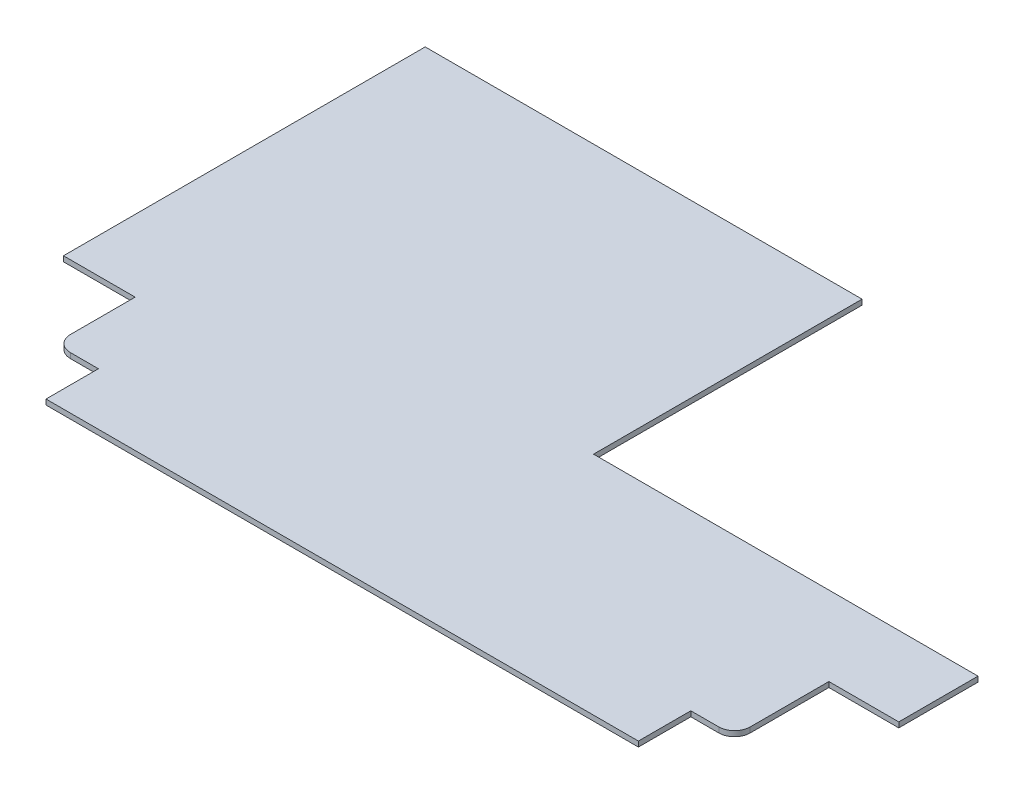
ISO-10303-21;
HEADER;
FILE_DESCRIPTION(('STEP AP214'),'2;1');
FILE_NAME('part.step','',(''),(''),'','','');
FILE_SCHEMA(('AUTOMOTIVE_DESIGN { 1 0 10303 214 1 1 1 1 }'));
ENDSEC;
DATA;
#1=APPLICATION_CONTEXT('core data for automotive mechanical design processes');
#2=APPLICATION_PROTOCOL_DEFINITION('international standard','automotive_design',2000,#1);
#3=PRODUCT_CONTEXT('',#1,'mechanical');
#4=PRODUCT('Part','Part','',(#3));
#5=PRODUCT_RELATED_PRODUCT_CATEGORY('part','',(#4));
#6=PRODUCT_DEFINITION_FORMATION('','',#4);
#7=PRODUCT_DEFINITION_CONTEXT('part definition',#1,'design');
#8=PRODUCT_DEFINITION('design','',#6,#7);
#9=PRODUCT_DEFINITION_SHAPE('','',#8);
#10=(LENGTH_UNIT() NAMED_UNIT(*) SI_UNIT(.MILLI.,.METRE.));
#11=(NAMED_UNIT(*) PLANE_ANGLE_UNIT() SI_UNIT($,.RADIAN.));
#12=(NAMED_UNIT(*) SI_UNIT($,.STERADIAN.) SOLID_ANGLE_UNIT());
#13=UNCERTAINTY_MEASURE_WITH_UNIT(LENGTH_MEASURE(1.E-05),#10,'distance_accuracy_value','');
#14=(GEOMETRIC_REPRESENTATION_CONTEXT(3) GLOBAL_UNCERTAINTY_ASSIGNED_CONTEXT((#13)) GLOBAL_UNIT_ASSIGNED_CONTEXT((#10,
#11,#12)) REPRESENTATION_CONTEXT('',''));
#15=CARTESIAN_POINT('',(0.,0.,0.));
#16=DIRECTION('',(0.,0.,1.));
#17=DIRECTION('',(1.,0.,0.));
#18=AXIS2_PLACEMENT_3D('',#15,#16,#17);
#19=CARTESIAN_POINT('',(-125.,3.,125.));
#20=DIRECTION('',(0.,0.,-1.));
#21=DIRECTION('',(-1.,0.,0.));
#22=AXIS2_PLACEMENT_3D('',#19,#20,#21);
#23=PLANE('',#22);
#24=DIRECTION('',(1.,0.,0.));
#25=VECTOR('',#24,1.);
#26=CARTESIAN_POINT('',(-125.,0.,125.));
#27=LINE('',#26,#25);
#28=CARTESIAN_POINT('',(280.,0.,125.));
#29=VERTEX_POINT('',#28);
#30=CARTESIAN_POINT('',(296.,0.,125.));
#31=VERTEX_POINT('',#30);
#32=EDGE_CURVE('E230',#29,#31,#27,.T.);
#33=ORIENTED_EDGE('',*,*,#32,.T.);
#34=DIRECTION('',(0.,1.,0.));
#35=VECTOR('',#34,1.);
#36=CARTESIAN_POINT('',(296.,0.,125.));
#37=LINE('',#36,#35);
#38=CARTESIAN_POINT('',(296.,3.,125.));
#39=VERTEX_POINT('',#38);
#40=EDGE_CURVE('E329',#31,#39,#37,.T.);
#41=ORIENTED_EDGE('',*,*,#40,.T.);
#42=DIRECTION('',(1.,0.,0.));
#43=VECTOR('',#42,1.);
#44=CARTESIAN_POINT('',(-125.,3.,125.));
#45=LINE('',#44,#43);
#46=CARTESIAN_POINT('',(280.,3.,125.));
#47=VERTEX_POINT('',#46);
#48=EDGE_CURVE('E49',#47,#39,#45,.T.);
#49=ORIENTED_EDGE('',*,*,#48,.F.);
#50=DIRECTION('',(0.,1.,0.));
#51=VECTOR('',#50,1.);
#52=CARTESIAN_POINT('',(280.,0.,125.));
#53=LINE('',#52,#51);
#54=EDGE_CURVE('E287',#29,#47,#53,.T.);
#55=ORIENTED_EDGE('',*,*,#54,.F.);
#56=EDGE_LOOP('',(#33,#41,#49,#55));
#57=FACE_BOUND('',#56,.T.);
#58=ADVANCED_FACE('F39',(#57),#23,.F.);
#59=CARTESIAN_POINT('',(-75.,0.,125.));
#60=VERTEX_POINT('',#59);
#61=CARTESIAN_POINT('',(-59.,0.,125.));
#62=VERTEX_POINT('',#61);
#63=EDGE_CURVE('E43',#60,#62,#27,.T.);
#64=ORIENTED_EDGE('',*,*,#63,.T.);
#65=DIRECTION('',(0.,1.,0.));
#66=VECTOR('',#65,1.);
#67=CARTESIAN_POINT('',(-59.,0.,125.));
#68=LINE('',#67,#66);
#69=CARTESIAN_POINT('',(-59.,3.,125.));
#70=VERTEX_POINT('',#69);
#71=EDGE_CURVE('E249',#62,#70,#68,.T.);
#72=ORIENTED_EDGE('',*,*,#71,.T.);
#73=CARTESIAN_POINT('',(-75.,3.,125.));
#74=VERTEX_POINT('',#73);
#75=EDGE_CURVE('E11',#74,#70,#45,.T.);
#76=ORIENTED_EDGE('',*,*,#75,.F.);
#77=DIRECTION('',(0.,1.,0.));
#78=VECTOR('',#77,1.);
#79=CARTESIAN_POINT('',(-75.,0.,125.));
#80=LINE('',#79,#78);
#81=EDGE_CURVE('E250',#60,#74,#80,.T.);
#82=ORIENTED_EDGE('',*,*,#81,.F.);
#83=EDGE_LOOP('',(#64,#72,#76,#82));
#84=FACE_BOUND('',#83,.T.);
#85=ADVANCED_FACE('F247',(#84),#23,.F.);
#86=CARTESIAN_POINT('',(0.,3.,0.));
#87=DIRECTION('',(0.,1.,0.));
#88=DIRECTION('',(0.,0.,1.));
#89=AXIS2_PLACEMENT_3D('',#86,#87,#88);
#90=PLANE('',#89);
#91=DIRECTION('',(0.,0.,-1.));
#92=VECTOR('',#91,1.);
#93=CARTESIAN_POINT('',(305.,3.,71.9999999999999));
#94=LINE('',#93,#92);
#95=CARTESIAN_POINT('',(305.,3.,116.));
#96=VERTEX_POINT('',#95);
#97=CARTESIAN_POINT('',(305.,3.,70.9999999999999));
#98=VERTEX_POINT('',#97);
#99=EDGE_CURVE('E334',#96,#98,#94,.T.);
#100=ORIENTED_EDGE('',*,*,#99,.T.);
#101=DIRECTION('',(-1.,0.,0.));
#102=VECTOR('',#101,1.);
#103=CARTESIAN_POINT('',(305.,3.,70.9999999999999));
#104=LINE('',#103,#102);
#105=CARTESIAN_POINT('',(345.,3.,70.9999999999999));
#106=VERTEX_POINT('',#105);
#107=EDGE_CURVE('E167',#106,#98,#104,.T.);
#108=ORIENTED_EDGE('',*,*,#107,.F.);
#109=DIRECTION('',(0.,0.,-1.));
#110=VECTOR('',#109,1.);
#111=CARTESIAN_POINT('',(345.,3.,125.));
#112=LINE('',#111,#110);
#113=CARTESIAN_POINT('',(345.,3.,25.6599999999999));
#114=VERTEX_POINT('',#113);
#115=EDGE_CURVE('E175',#106,#114,#112,.T.);
#116=ORIENTED_EDGE('',*,*,#115,.T.);
#117=DIRECTION('',(-1.,0.,0.));
#118=VECTOR('',#117,1.);
#119=CARTESIAN_POINT('',(125.,3.,25.6599999999999));
#120=LINE('',#119,#118);
#121=CARTESIAN_POINT('',(125.,3.,25.6599999999999));
#122=VERTEX_POINT('',#121);
#123=EDGE_CURVE('E184',#114,#122,#120,.T.);
#124=ORIENTED_EDGE('',*,*,#123,.T.);
#125=DIRECTION('',(0.,0.,-1.));
#126=VECTOR('',#125,1.);
#127=CARTESIAN_POINT('',(125.,3.,-125.));
#128=LINE('',#127,#126);
#129=CARTESIAN_POINT('',(125.,3.,-128.));
#130=VERTEX_POINT('',#129);
#131=EDGE_CURVE('E221',#122,#130,#128,.T.);
#132=ORIENTED_EDGE('',*,*,#131,.T.);
#133=DIRECTION('',(-1.,0.,0.));
#134=VECTOR('',#133,1.);
#135=CARTESIAN_POINT('',(-125.,3.,-128.));
#136=LINE('',#135,#134);
#137=CARTESIAN_POINT('',(-125.,3.,-128.));
#138=VERTEX_POINT('',#137);
#139=EDGE_CURVE('E202',#130,#138,#136,.T.);
#140=ORIENTED_EDGE('',*,*,#139,.T.);
#141=DIRECTION('',(0.,0.,1.));
#142=VECTOR('',#141,1.);
#143=CARTESIAN_POINT('',(-125.,3.,-125.));
#144=LINE('',#143,#142);
#145=CARTESIAN_POINT('',(-125.,3.,79.));
#146=VERTEX_POINT('',#145);
#147=EDGE_CURVE('E224',#138,#146,#144,.T.);
#148=ORIENTED_EDGE('',*,*,#147,.T.);
#149=DIRECTION('',(1.,0.,0.));
#150=VECTOR('',#149,1.);
#151=CARTESIAN_POINT('',(-125.,3.,79.));
#152=LINE('',#151,#150);
#153=CARTESIAN_POINT('',(-84.,3.,79.));
#154=VERTEX_POINT('',#153);
#155=EDGE_CURVE('E315',#146,#154,#152,.T.);
#156=ORIENTED_EDGE('',*,*,#155,.T.);
#157=DIRECTION('',(0.,0.,-1.));
#158=VECTOR('',#157,1.);
#159=CARTESIAN_POINT('',(-84.,3.,125.));
#160=LINE('',#159,#158);
#161=CARTESIAN_POINT('',(-84.,3.,116.));
#162=VERTEX_POINT('',#161);
#163=EDGE_CURVE('E62',#162,#154,#160,.T.);
#164=ORIENTED_EDGE('',*,*,#163,.F.);
#165=CARTESIAN_POINT('',(-75.,3.,116.));
#166=DIRECTION('',(0.,-1.,0.));
#167=DIRECTION('',(0.,0.,-1.));
#168=AXIS2_PLACEMENT_3D('',#165,#166,#167);
#169=CIRCLE('',#168,8.99999999999999);
#170=EDGE_CURVE('E286',#74,#162,#169,.T.);
#171=ORIENTED_EDGE('',*,*,#170,.F.);
#172=ORIENTED_EDGE('',*,*,#75,.T.);
#173=DIRECTION('',(0.,0.,1.));
#174=VECTOR('',#173,1.);
#175=CARTESIAN_POINT('',(-59.,3.,125.));
#176=LINE('',#175,#174);
#177=CARTESIAN_POINT('',(-59.,3.,155.));
#178=VERTEX_POINT('',#177);
#179=EDGE_CURVE('E277',#70,#178,#176,.T.);
#180=ORIENTED_EDGE('',*,*,#179,.T.);
#181=DIRECTION('',(1.,0.,0.));
#182=VECTOR('',#181,1.);
#183=CARTESIAN_POINT('',(-59.,3.,155.));
#184=LINE('',#183,#182);
#185=CARTESIAN_POINT('',(280.,3.,155.));
#186=VERTEX_POINT('',#185);
#187=EDGE_CURVE('E268',#178,#186,#184,.T.);
#188=ORIENTED_EDGE('',*,*,#187,.T.);
#189=DIRECTION('',(0.,0.,-1.));
#190=VECTOR('',#189,1.);
#191=CARTESIAN_POINT('',(280.,3.,125.));
#192=LINE('',#191,#190);
#193=EDGE_CURVE('E262',#186,#47,#192,.T.);
#194=ORIENTED_EDGE('',*,*,#193,.T.);
#195=ORIENTED_EDGE('',*,*,#48,.T.);
#196=CARTESIAN_POINT('',(296.,3.,116.));
#197=DIRECTION('',(0.,1.,0.));
#198=DIRECTION('',(0.,0.,-1.));
#199=AXIS2_PLACEMENT_3D('',#196,#197,#198);
#200=CIRCLE('',#199,9.00000000000001);
#201=EDGE_CURVE('E324',#39,#96,#200,.T.);
#202=ORIENTED_EDGE('',*,*,#201,.T.);
#203=EDGE_LOOP('',(#100,#108,#116,#124,#132,#140,#148,#156,#164,#171,#172,#180,#188,#194,#195,#202));
#204=FACE_BOUND('',#203,.T.);
#205=ADVANCED_FACE('F340',(#204),#90,.T.);
#206=CARTESIAN_POINT('',(0.,0.,0.));
#207=DIRECTION('',(0.,1.,0.));
#208=DIRECTION('',(0.,0.,1.));
#209=AXIS2_PLACEMENT_3D('',#206,#207,#208);
#210=PLANE('',#209);
#211=DIRECTION('',(-1.,0.,0.));
#212=VECTOR('',#211,1.);
#213=CARTESIAN_POINT('',(305.,0.,70.9999999999999));
#214=LINE('',#213,#212);
#215=CARTESIAN_POINT('',(345.,0.,70.9999999999999));
#216=VERTEX_POINT('',#215);
#217=CARTESIAN_POINT('',(305.,0.,70.9999999999999));
#218=VERTEX_POINT('',#217);
#219=EDGE_CURVE('E155',#216,#218,#214,.T.);
#220=ORIENTED_EDGE('',*,*,#219,.T.);
#221=DIRECTION('',(0.,0.,-1.));
#222=VECTOR('',#221,1.);
#223=CARTESIAN_POINT('',(305.,0.,71.9999999999999));
#224=LINE('',#223,#222);
#225=CARTESIAN_POINT('',(305.,0.,116.));
#226=VERTEX_POINT('',#225);
#227=EDGE_CURVE('E335',#226,#218,#224,.T.);
#228=ORIENTED_EDGE('',*,*,#227,.F.);
#229=CARTESIAN_POINT('',(296.,0.,116.));
#230=DIRECTION('',(0.,1.,0.));
#231=DIRECTION('',(0.,0.,-1.));
#232=AXIS2_PLACEMENT_3D('',#229,#230,#231);
#233=CIRCLE('',#232,9.00000000000001);
#234=EDGE_CURVE('E326',#31,#226,#233,.T.);
#235=ORIENTED_EDGE('',*,*,#234,.F.);
#236=ORIENTED_EDGE('',*,*,#32,.F.);
#237=DIRECTION('',(0.,0.,-1.));
#238=VECTOR('',#237,1.);
#239=CARTESIAN_POINT('',(280.,0.,125.));
#240=LINE('',#239,#238);
#241=CARTESIAN_POINT('',(280.,0.,155.));
#242=VERTEX_POINT('',#241);
#243=EDGE_CURVE('E266',#242,#29,#240,.T.);
#244=ORIENTED_EDGE('',*,*,#243,.F.);
#245=DIRECTION('',(1.,0.,0.));
#246=VECTOR('',#245,1.);
#247=CARTESIAN_POINT('',(-59.,0.,155.));
#248=LINE('',#247,#246);
#249=CARTESIAN_POINT('',(-59.,0.,155.));
#250=VERTEX_POINT('',#249);
#251=EDGE_CURVE('E259',#250,#242,#248,.T.);
#252=ORIENTED_EDGE('',*,*,#251,.F.);
#253=DIRECTION('',(0.,0.,1.));
#254=VECTOR('',#253,1.);
#255=CARTESIAN_POINT('',(-59.,0.,125.));
#256=LINE('',#255,#254);
#257=EDGE_CURVE('E256',#62,#250,#256,.T.);
#258=ORIENTED_EDGE('',*,*,#257,.F.);
#259=ORIENTED_EDGE('',*,*,#63,.F.);
#260=CARTESIAN_POINT('',(-75.,0.,116.));
#261=DIRECTION('',(0.,-1.,0.));
#262=DIRECTION('',(0.,0.,-1.));
#263=AXIS2_PLACEMENT_3D('',#260,#261,#262);
#264=CIRCLE('',#263,8.99999999999999);
#265=CARTESIAN_POINT('',(-84.,0.,116.));
#266=VERTEX_POINT('',#265);
#267=EDGE_CURVE('E253',#60,#266,#264,.T.);
#268=ORIENTED_EDGE('',*,*,#267,.T.);
#269=DIRECTION('',(0.,0.,-1.));
#270=VECTOR('',#269,1.);
#271=CARTESIAN_POINT('',(-84.,0.,125.));
#272=LINE('',#271,#270);
#273=CARTESIAN_POINT('',(-84.,0.,79.));
#274=VERTEX_POINT('',#273);
#275=EDGE_CURVE('E196',#266,#274,#272,.T.);
#276=ORIENTED_EDGE('',*,*,#275,.T.);
#277=DIRECTION('',(1.,0.,0.));
#278=VECTOR('',#277,1.);
#279=CARTESIAN_POINT('',(-125.,0.,79.));
#280=LINE('',#279,#278);
#281=CARTESIAN_POINT('',(-125.,0.,79.));
#282=VERTEX_POINT('',#281);
#283=EDGE_CURVE('E308',#282,#274,#280,.T.);
#284=ORIENTED_EDGE('',*,*,#283,.F.);
#285=DIRECTION('',(0.,0.,1.));
#286=VECTOR('',#285,1.);
#287=CARTESIAN_POINT('',(-125.,0.,-125.));
#288=LINE('',#287,#286);
#289=CARTESIAN_POINT('',(-125.,0.,-128.));
#290=VERTEX_POINT('',#289);
#291=EDGE_CURVE('E228',#290,#282,#288,.T.);
#292=ORIENTED_EDGE('',*,*,#291,.F.);
#293=DIRECTION('',(-1.,0.,0.));
#294=VECTOR('',#293,1.);
#295=CARTESIAN_POINT('',(-125.,0.,-128.));
#296=LINE('',#295,#294);
#297=CARTESIAN_POINT('',(125.,0.,-128.));
#298=VERTEX_POINT('',#297);
#299=EDGE_CURVE('E205',#298,#290,#296,.T.);
#300=ORIENTED_EDGE('',*,*,#299,.F.);
#301=DIRECTION('',(0.,0.,-1.));
#302=VECTOR('',#301,1.);
#303=CARTESIAN_POINT('',(125.,0.,-125.));
#304=LINE('',#303,#302);
#305=CARTESIAN_POINT('',(125.,0.,25.6599999999999));
#306=VERTEX_POINT('',#305);
#307=EDGE_CURVE('E217',#306,#298,#304,.T.);
#308=ORIENTED_EDGE('',*,*,#307,.F.);
#309=DIRECTION('',(-1.,0.,0.));
#310=VECTOR('',#309,1.);
#311=CARTESIAN_POINT('',(125.,0.,25.6599999999999));
#312=LINE('',#311,#310);
#313=CARTESIAN_POINT('',(345.,0.,25.6599999999999));
#314=VERTEX_POINT('',#313);
#315=EDGE_CURVE('E182',#314,#306,#312,.T.);
#316=ORIENTED_EDGE('',*,*,#315,.F.);
#317=DIRECTION('',(0.,0.,-1.));
#318=VECTOR('',#317,1.);
#319=CARTESIAN_POINT('',(345.,0.,125.));
#320=LINE('',#319,#318);
#321=EDGE_CURVE('E173',#216,#314,#320,.T.);
#322=ORIENTED_EDGE('',*,*,#321,.F.);
#323=EDGE_LOOP('',(#220,#228,#235,#236,#244,#252,#258,#259,#268,#276,#284,#292,#300,#308,#316,#322));
#324=FACE_BOUND('',#323,.T.);
#325=ADVANCED_FACE('F179',(#324),#210,.F.);
#326=CARTESIAN_POINT('',(-84.,0.,125.));
#327=DIRECTION('',(1.,0.,0.));
#328=DIRECTION('',(0.,0.,-1.));
#329=AXIS2_PLACEMENT_3D('',#326,#327,#328);
#330=PLANE('',#329);
#331=ORIENTED_EDGE('',*,*,#163,.T.);
#332=DIRECTION('',(0.,1.,0.));
#333=VECTOR('',#332,1.);
#334=CARTESIAN_POINT('',(-84.,0.,79.));
#335=LINE('',#334,#333);
#336=EDGE_CURVE('E57',#274,#154,#335,.T.);
#337=ORIENTED_EDGE('',*,*,#336,.F.);
#338=ORIENTED_EDGE('',*,*,#275,.F.);
#339=DIRECTION('',(0.,1.,0.));
#340=VECTOR('',#339,1.);
#341=CARTESIAN_POINT('',(-84.,0.,116.));
#342=LINE('',#341,#340);
#343=EDGE_CURVE('E300',#266,#162,#342,.T.);
#344=ORIENTED_EDGE('',*,*,#343,.T.);
#345=EDGE_LOOP('',(#331,#337,#338,#344));
#346=FACE_BOUND('',#345,.T.);
#347=ADVANCED_FACE('F364',(#346),#330,.F.);
#348=CARTESIAN_POINT('',(125.,3.,-125.));
#349=DIRECTION('',(-1.,0.,0.));
#350=DIRECTION('',(0.,0.,1.));
#351=AXIS2_PLACEMENT_3D('',#348,#349,#350);
#352=PLANE('',#351);
#353=DIRECTION('',(0.,1.,0.));
#354=VECTOR('',#353,1.);
#355=CARTESIAN_POINT('',(125.,0.,25.6599999999999));
#356=LINE('',#355,#354);
#357=EDGE_CURVE('E198',#306,#122,#356,.T.);
#358=ORIENTED_EDGE('',*,*,#357,.F.);
#359=ORIENTED_EDGE('',*,*,#307,.T.);
#360=DIRECTION('',(0.,1.,0.));
#361=VECTOR('',#360,1.);
#362=CARTESIAN_POINT('',(125.,0.,-128.));
#363=LINE('',#362,#361);
#364=EDGE_CURVE('E209',#298,#130,#363,.T.);
#365=ORIENTED_EDGE('',*,*,#364,.T.);
#366=ORIENTED_EDGE('',*,*,#131,.F.);
#367=EDGE_LOOP('',(#358,#359,#365,#366));
#368=FACE_BOUND('',#367,.T.);
#369=ADVANCED_FACE('F41',(#368),#352,.F.);
#370=CARTESIAN_POINT('',(-125.,3.,-125.));
#371=DIRECTION('',(1.,0.,0.));
#372=DIRECTION('',(0.,0.,-1.));
#373=AXIS2_PLACEMENT_3D('',#370,#371,#372);
#374=PLANE('',#373);
#375=ORIENTED_EDGE('',*,*,#291,.T.);
#376=DIRECTION('',(0.,1.,0.));
#377=VECTOR('',#376,1.);
#378=CARTESIAN_POINT('',(-125.,0.,79.));
#379=LINE('',#378,#377);
#380=EDGE_CURVE('E313',#282,#146,#379,.T.);
#381=ORIENTED_EDGE('',*,*,#380,.T.);
#382=ORIENTED_EDGE('',*,*,#147,.F.);
#383=DIRECTION('',(0.,1.,0.));
#384=VECTOR('',#383,1.);
#385=CARTESIAN_POINT('',(-125.,0.,-128.));
#386=LINE('',#385,#384);
#387=EDGE_CURVE('E213',#290,#138,#386,.T.);
#388=ORIENTED_EDGE('',*,*,#387,.F.);
#389=EDGE_LOOP('',(#375,#381,#382,#388));
#390=FACE_BOUND('',#389,.T.);
#391=ADVANCED_FACE('F372',(#390),#374,.F.);
#392=CARTESIAN_POINT('',(-125.,0.,-128.));
#393=DIRECTION('',(0.,0.,-1.));
#394=DIRECTION('',(-1.,0.,0.));
#395=AXIS2_PLACEMENT_3D('',#392,#393,#394);
#396=PLANE('',#395);
#397=ORIENTED_EDGE('',*,*,#139,.F.);
#398=ORIENTED_EDGE('',*,*,#364,.F.);
#399=ORIENTED_EDGE('',*,*,#299,.T.);
#400=ORIENTED_EDGE('',*,*,#387,.T.);
#401=EDGE_LOOP('',(#397,#398,#399,#400));
#402=FACE_BOUND('',#401,.T.);
#403=ADVANCED_FACE('F387',(#402),#396,.T.);
#404=CARTESIAN_POINT('',(125.,0.,25.6599999999999));
#405=DIRECTION('',(0.,0.,-1.));
#406=DIRECTION('',(-1.,0.,0.));
#407=AXIS2_PLACEMENT_3D('',#404,#405,#406);
#408=PLANE('',#407);
#409=ORIENTED_EDGE('',*,*,#123,.F.);
#410=DIRECTION('',(0.,1.,0.));
#411=VECTOR('',#410,1.);
#412=CARTESIAN_POINT('',(345.,0.,25.6599999999999));
#413=LINE('',#412,#411);
#414=EDGE_CURVE('E188',#314,#114,#413,.T.);
#415=ORIENTED_EDGE('',*,*,#414,.F.);
#416=ORIENTED_EDGE('',*,*,#315,.T.);
#417=ORIENTED_EDGE('',*,*,#357,.T.);
#418=EDGE_LOOP('',(#409,#415,#416,#417));
#419=FACE_BOUND('',#418,.T.);
#420=ADVANCED_FACE('F391',(#419),#408,.T.);
#421=CARTESIAN_POINT('',(345.,0.,125.));
#422=DIRECTION('',(1.,0.,0.));
#423=DIRECTION('',(0.,0.,-1.));
#424=AXIS2_PLACEMENT_3D('',#421,#422,#423);
#425=PLANE('',#424);
#426=DIRECTION('',(0.,1.,0.));
#427=VECTOR('',#426,1.);
#428=CARTESIAN_POINT('',(345.,0.,70.9999999999999));
#429=LINE('',#428,#427);
#430=EDGE_CURVE('E159',#216,#106,#429,.T.);
#431=ORIENTED_EDGE('',*,*,#430,.F.);
#432=ORIENTED_EDGE('',*,*,#321,.T.);
#433=ORIENTED_EDGE('',*,*,#414,.T.);
#434=ORIENTED_EDGE('',*,*,#115,.F.);
#435=EDGE_LOOP('',(#431,#432,#433,#434));
#436=FACE_BOUND('',#435,.T.);
#437=ADVANCED_FACE('F171',(#436),#425,.T.);
#438=CARTESIAN_POINT('',(-75.,0.,116.));
#439=DIRECTION('',(0.,1.,0.));
#440=DIRECTION('',(0.,0.,1.));
#441=AXIS2_PLACEMENT_3D('',#438,#439,#440);
#442=CYLINDRICAL_SURFACE('',#441,8.99999999999999);
#443=ORIENTED_EDGE('',*,*,#170,.T.);
#444=ORIENTED_EDGE('',*,*,#343,.F.);
#445=ORIENTED_EDGE('',*,*,#267,.F.);
#446=ORIENTED_EDGE('',*,*,#81,.T.);
#447=EDGE_LOOP('',(#443,#444,#445,#446));
#448=FACE_BOUND('',#447,.T.);
#449=ADVANCED_FACE('F363',(#448),#442,.T.);
#450=CARTESIAN_POINT('',(-59.,0.,125.));
#451=DIRECTION('',(-1.,0.,0.));
#452=DIRECTION('',(0.,0.,1.));
#453=AXIS2_PLACEMENT_3D('',#450,#451,#452);
#454=PLANE('',#453);
#455=ORIENTED_EDGE('',*,*,#179,.F.);
#456=ORIENTED_EDGE('',*,*,#71,.F.);
#457=ORIENTED_EDGE('',*,*,#257,.T.);
#458=DIRECTION('',(0.,1.,0.));
#459=VECTOR('',#458,1.);
#460=CARTESIAN_POINT('',(-59.,0.,155.));
#461=LINE('',#460,#459);
#462=EDGE_CURVE('E276',#250,#178,#461,.T.);
#463=ORIENTED_EDGE('',*,*,#462,.T.);
#464=EDGE_LOOP('',(#455,#456,#457,#463));
#465=FACE_BOUND('',#464,.T.);
#466=ADVANCED_FACE('F360',(#465),#454,.T.);
#467=CARTESIAN_POINT('',(280.,0.,125.));
#468=DIRECTION('',(1.,0.,0.));
#469=DIRECTION('',(0.,0.,-1.));
#470=AXIS2_PLACEMENT_3D('',#467,#468,#469);
#471=PLANE('',#470);
#472=ORIENTED_EDGE('',*,*,#193,.F.);
#473=DIRECTION('',(0.,1.,0.));
#474=VECTOR('',#473,1.);
#475=CARTESIAN_POINT('',(280.,0.,155.));
#476=LINE('',#475,#474);
#477=EDGE_CURVE('E291',#242,#186,#476,.T.);
#478=ORIENTED_EDGE('',*,*,#477,.F.);
#479=ORIENTED_EDGE('',*,*,#243,.T.);
#480=ORIENTED_EDGE('',*,*,#54,.T.);
#481=EDGE_LOOP('',(#472,#478,#479,#480));
#482=FACE_BOUND('',#481,.T.);
#483=ADVANCED_FACE('F357',(#482),#471,.T.);
#484=CARTESIAN_POINT('',(-59.,0.,155.));
#485=DIRECTION('',(0.,0.,1.));
#486=DIRECTION('',(1.,0.,0.));
#487=AXIS2_PLACEMENT_3D('',#484,#485,#486);
#488=PLANE('',#487);
#489=ORIENTED_EDGE('',*,*,#187,.F.);
#490=ORIENTED_EDGE('',*,*,#462,.F.);
#491=ORIENTED_EDGE('',*,*,#251,.T.);
#492=ORIENTED_EDGE('',*,*,#477,.T.);
#493=EDGE_LOOP('',(#489,#490,#491,#492));
#494=FACE_BOUND('',#493,.T.);
#495=ADVANCED_FACE('F359',(#494),#488,.T.);
#496=CARTESIAN_POINT('',(305.,0.,71.9999999999999));
#497=DIRECTION('',(1.,0.,0.));
#498=DIRECTION('',(0.,0.,-1.));
#499=AXIS2_PLACEMENT_3D('',#496,#497,#498);
#500=PLANE('',#499);
#501=ORIENTED_EDGE('',*,*,#99,.F.);
#502=DIRECTION('',(0.,1.,0.));
#503=VECTOR('',#502,1.);
#504=CARTESIAN_POINT('',(305.,0.,116.));
#505=LINE('',#504,#503);
#506=EDGE_CURVE('E271',#226,#96,#505,.T.);
#507=ORIENTED_EDGE('',*,*,#506,.F.);
#508=ORIENTED_EDGE('',*,*,#227,.T.);
#509=DIRECTION('',(0.,1.,0.));
#510=VECTOR('',#509,1.);
#511=CARTESIAN_POINT('',(305.,0.,70.9999999999999));
#512=LINE('',#511,#510);
#513=EDGE_CURVE('E162',#218,#98,#512,.T.);
#514=ORIENTED_EDGE('',*,*,#513,.T.);
#515=EDGE_LOOP('',(#501,#507,#508,#514));
#516=FACE_BOUND('',#515,.T.);
#517=ADVANCED_FACE('F345',(#516),#500,.T.);
#518=CARTESIAN_POINT('',(296.,0.,116.));
#519=DIRECTION('',(0.,1.,0.));
#520=DIRECTION('',(0.,0.,1.));
#521=AXIS2_PLACEMENT_3D('',#518,#519,#520);
#522=CYLINDRICAL_SURFACE('',#521,9.00000000000001);
#523=ORIENTED_EDGE('',*,*,#201,.F.);
#524=ORIENTED_EDGE('',*,*,#40,.F.);
#525=ORIENTED_EDGE('',*,*,#234,.T.);
#526=ORIENTED_EDGE('',*,*,#506,.T.);
#527=EDGE_LOOP('',(#523,#524,#525,#526));
#528=FACE_BOUND('',#527,.T.);
#529=ADVANCED_FACE('F351',(#528),#522,.T.);
#530=CARTESIAN_POINT('',(-125.,0.,79.));
#531=DIRECTION('',(0.,0.,1.));
#532=DIRECTION('',(1.,0.,0.));
#533=AXIS2_PLACEMENT_3D('',#530,#531,#532);
#534=PLANE('',#533);
#535=ORIENTED_EDGE('',*,*,#155,.F.);
#536=ORIENTED_EDGE('',*,*,#380,.F.);
#537=ORIENTED_EDGE('',*,*,#283,.T.);
#538=ORIENTED_EDGE('',*,*,#336,.T.);
#539=EDGE_LOOP('',(#535,#536,#537,#538));
#540=FACE_BOUND('',#539,.T.);
#541=ADVANCED_FACE('F311',(#540),#534,.T.);
#542=CARTESIAN_POINT('',(305.,0.,70.9999999999999));
#543=DIRECTION('',(0.,0.,-1.));
#544=DIRECTION('',(-1.,0.,0.));
#545=AXIS2_PLACEMENT_3D('',#542,#543,#544);
#546=PLANE('',#545);
#547=ORIENTED_EDGE('',*,*,#107,.T.);
#548=ORIENTED_EDGE('',*,*,#513,.F.);
#549=ORIENTED_EDGE('',*,*,#219,.F.);
#550=ORIENTED_EDGE('',*,*,#430,.T.);
#551=EDGE_LOOP('',(#547,#548,#549,#550));
#552=FACE_BOUND('',#551,.T.);
#553=ADVANCED_FACE('F158',(#552),#546,.F.);
#554=CLOSED_SHELL('',(#58,#85,#205,#325,#347,#369,#391,#403,#420,#437,#449,#466,#483,#495,#517,
#529,#541,#553));
#555=MANIFOLD_SOLID_BREP('B2',#554);
#556=ADVANCED_BREP_SHAPE_REPRESENTATION('',(#18,#555),#14);
#557=SHAPE_DEFINITION_REPRESENTATION(#9,#556);
ENDSEC;
END-ISO-10303-21;
